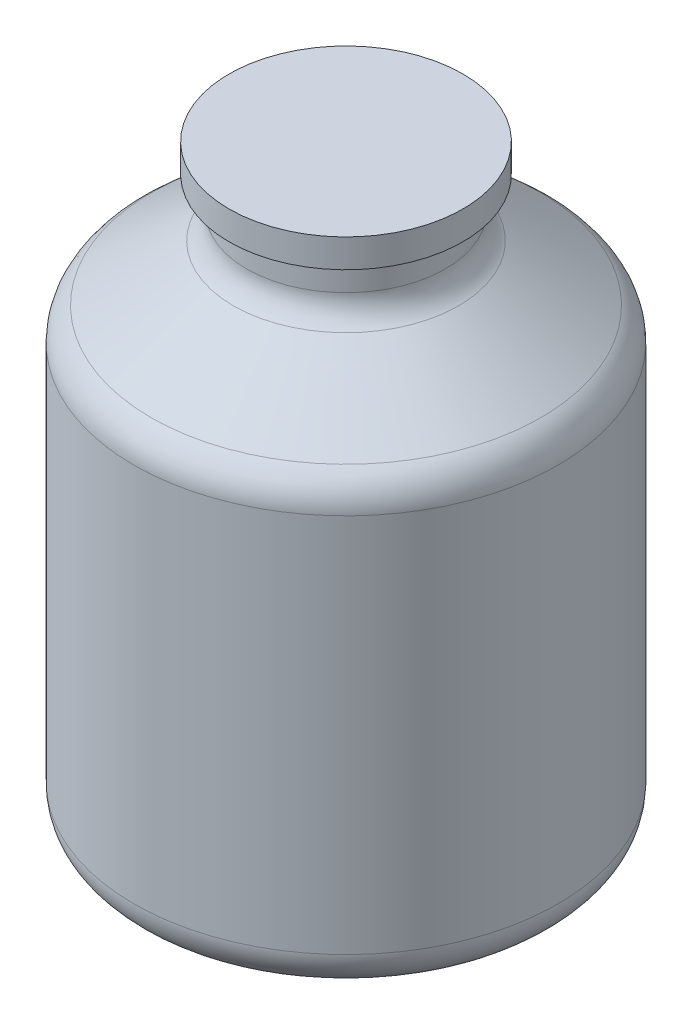
ISO-10303-21;
HEADER;
FILE_DESCRIPTION(('STEP AP214'),'2;1');
FILE_NAME('part.step','',(''),(''),'','','');
FILE_SCHEMA(('AUTOMOTIVE_DESIGN { 1 0 10303 214 1 1 1 1 }'));
ENDSEC;
DATA;
#1=APPLICATION_CONTEXT('core data for automotive mechanical design processes');
#2=APPLICATION_PROTOCOL_DEFINITION('international standard','automotive_design',2000,#1);
#3=PRODUCT_CONTEXT('',#1,'mechanical');
#4=PRODUCT('Part','Part','',(#3));
#5=PRODUCT_RELATED_PRODUCT_CATEGORY('part','',(#4));
#6=PRODUCT_DEFINITION_FORMATION('','',#4);
#7=PRODUCT_DEFINITION_CONTEXT('part definition',#1,'design');
#8=PRODUCT_DEFINITION('design','',#6,#7);
#9=PRODUCT_DEFINITION_SHAPE('','',#8);
#10=(LENGTH_UNIT() NAMED_UNIT(*) SI_UNIT(.MILLI.,.METRE.));
#11=(NAMED_UNIT(*) PLANE_ANGLE_UNIT() SI_UNIT($,.RADIAN.));
#12=(NAMED_UNIT(*) SI_UNIT($,.STERADIAN.) SOLID_ANGLE_UNIT());
#13=UNCERTAINTY_MEASURE_WITH_UNIT(LENGTH_MEASURE(1.E-05),#10,'distance_accuracy_value','');
#14=(GEOMETRIC_REPRESENTATION_CONTEXT(3) GLOBAL_UNCERTAINTY_ASSIGNED_CONTEXT((#13)) GLOBAL_UNIT_ASSIGNED_CONTEXT((#10,
#11,#12)) REPRESENTATION_CONTEXT('',''));
#15=CARTESIAN_POINT('',(0.,0.,0.));
#16=DIRECTION('',(0.,0.,1.));
#17=DIRECTION('',(1.,0.,0.));
#18=AXIS2_PLACEMENT_3D('',#15,#16,#17);
#19=CARTESIAN_POINT('',(0.,0.,0.));
#20=DIRECTION('',(0.,1.,0.));
#21=DIRECTION('',(0.,0.,1.));
#22=AXIS2_PLACEMENT_3D('',#19,#20,#21);
#23=PLANE('',#22);
#24=CARTESIAN_POINT('',(0.,0.,0.));
#25=DIRECTION('',(0.,1.,0.));
#26=DIRECTION('',(0.,0.,1.));
#27=AXIS2_PLACEMENT_3D('',#24,#25,#26);
#28=CIRCLE('',#27,55.8506106293866);
#29=CARTESIAN_POINT('',(0.,0.,55.8506106293866));
#30=VERTEX_POINT('',#29);
#31=EDGE_CURVE('E10',#30,#30,#28,.T.);
#32=ORIENTED_EDGE('',*,*,#31,.F.);
#33=EDGE_LOOP('',(#32));
#34=FACE_BOUND('',#33,.T.);
#35=ADVANCED_FACE('F31',(#34),#23,.F.);
#36=CARTESIAN_POINT('',(0.,12.7,0.));
#37=DIRECTION('',(0.,1.,0.));
#38=DIRECTION('',(0.,0.,1.));
#39=AXIS2_PLACEMENT_3D('',#36,#37,#38);
#40=TOROIDAL_SURFACE('',#39,55.8506106293866,12.7);
#41=CARTESIAN_POINT('',(0.,12.7,0.));
#42=DIRECTION('',(0.,1.,0.));
#43=DIRECTION('',(0.,0.,1.));
#44=AXIS2_PLACEMENT_3D('',#41,#42,#43);
#45=CIRCLE('',#44,68.5506106293866);
#46=CARTESIAN_POINT('',(0.,12.7,68.5506106293866));
#47=VERTEX_POINT('',#46);
#48=EDGE_CURVE('E37',#47,#47,#45,.T.);
#49=ORIENTED_EDGE('',*,*,#48,.F.);
#50=EDGE_LOOP('',(#49));
#51=FACE_BOUND('',#50,.T.);
#52=ORIENTED_EDGE('',*,*,#31,.T.);
#53=EDGE_LOOP('',(#52));
#54=FACE_BOUND('',#53,.T.);
#55=ADVANCED_FACE('F106',(#51,#54),#40,.T.);
#56=CARTESIAN_POINT('',(0.,191.88999199796,0.));
#57=DIRECTION('',(0.,1.,0.));
#58=DIRECTION('',(0.,0.,1.));
#59=AXIS2_PLACEMENT_3D('',#56,#57,#58);
#60=CYLINDRICAL_SURFACE('',#59,68.5506106293866);
#61=CARTESIAN_POINT('',(0.,135.537090780889,0.));
#62=DIRECTION('',(0.,1.,0.));
#63=DIRECTION('',(0.,0.,1.));
#64=AXIS2_PLACEMENT_3D('',#61,#62,#63);
#65=CIRCLE('',#64,68.5506106293866);
#66=CARTESIAN_POINT('',(0.,135.537090780889,68.5506106293866));
#67=VERTEX_POINT('',#66);
#68=EDGE_CURVE('E41',#67,#67,#65,.T.);
#69=ORIENTED_EDGE('',*,*,#68,.F.);
#70=EDGE_LOOP('',(#69));
#71=FACE_BOUND('',#70,.T.);
#72=ORIENTED_EDGE('',*,*,#48,.T.);
#73=EDGE_LOOP('',(#72));
#74=FACE_BOUND('',#73,.T.);
#75=ADVANCED_FACE('F101',(#71,#74),#60,.T.);
#76=CARTESIAN_POINT('',(0.,135.537090780889,0.));
#77=DIRECTION('',(0.,1.,0.));
#78=DIRECTION('',(0.,0.,1.));
#79=AXIS2_PLACEMENT_3D('',#76,#77,#78);
#80=TOROIDAL_SURFACE('',#79,55.8506106293866,12.7);
#81=CARTESIAN_POINT('',(0.,146.041145392436,0.));
#82=DIRECTION('',(0.,1.,0.));
#83=DIRECTION('',(0.,0.,1.));
#84=AXIS2_PLACEMENT_3D('',#81,#82,#83);
#85=CIRCLE('',#84,62.9888762953326);
#86=CARTESIAN_POINT('',(0.,146.041145392436,62.9888762953326));
#87=VERTEX_POINT('',#86);
#88=EDGE_CURVE('E45',#87,#87,#85,.T.);
#89=ORIENTED_EDGE('',*,*,#88,.F.);
#90=EDGE_LOOP('',(#89));
#91=FACE_BOUND('',#90,.T.);
#92=ORIENTED_EDGE('',*,*,#68,.T.);
#93=EDGE_LOOP('',(#92));
#94=FACE_BOUND('',#93,.T.);
#95=ADVANCED_FACE('F95',(#91,#94),#80,.T.);
#96=CARTESIAN_POINT('',(0.,146.041145392436,0.));
#97=DIRECTION('',(0.,-1.,0.));
#98=DIRECTION('',(0.,0.,-1.));
#99=AXIS2_PLACEMENT_3D('',#96,#97,#98);
#100=CONICAL_SURFACE('',#99,62.9888762953326,0.973912118745665);
#101=CARTESIAN_POINT('',(0.,164.092378592853,0.));
#102=DIRECTION('',(0.,1.,0.));
#103=DIRECTION('',(0.,0.,1.));
#104=AXIS2_PLACEMENT_3D('',#101,#102,#103);
#105=CIRCLE('',#104,36.4262421463226);
#106=CARTESIAN_POINT('',(0.,164.092378592853,36.4262421463226));
#107=VERTEX_POINT('',#106);
#108=EDGE_CURVE('E50',#107,#107,#105,.T.);
#109=ORIENTED_EDGE('',*,*,#108,.F.);
#110=EDGE_LOOP('',(#109));
#111=FACE_BOUND('',#110,.T.);
#112=ORIENTED_EDGE('',*,*,#88,.T.);
#113=EDGE_LOOP('',(#112));
#114=FACE_BOUND('',#113,.T.);
#115=ADVANCED_FACE('F89',(#111,#114),#100,.T.);
#116=CARTESIAN_POINT('',(0.,172.244930881121,0.));
#117=DIRECTION('',(0.,1.,0.));
#118=DIRECTION('',(0.,0.,1.));
#119=AXIS2_PLACEMENT_3D('',#116,#117,#118);
#120=TOROIDAL_SURFACE('',#119,41.9664917205388,9.85689982487104);
#121=CARTESIAN_POINT('',(0.,172.244930881121,0.));
#122=DIRECTION('',(0.,1.,0.));
#123=DIRECTION('',(0.,0.,1.));
#124=AXIS2_PLACEMENT_3D('',#121,#122,#123);
#125=CIRCLE('',#124,32.1095918956678);
#126=CARTESIAN_POINT('',(0.,172.244930881121,32.1095918956678));
#127=VERTEX_POINT('',#126);
#128=EDGE_CURVE('E53',#127,#127,#125,.T.);
#129=ORIENTED_EDGE('',*,*,#128,.F.);
#130=EDGE_LOOP('',(#129));
#131=FACE_BOUND('',#130,.T.);
#132=ORIENTED_EDGE('',*,*,#108,.T.);
#133=EDGE_LOOP('',(#132));
#134=FACE_BOUND('',#133,.T.);
#135=ADVANCED_FACE('F83',(#131,#134),#120,.F.);
#136=CARTESIAN_POINT('',(0.,191.88999199796,0.));
#137=DIRECTION('',(0.,1.,0.));
#138=DIRECTION('',(0.,0.,1.));
#139=AXIS2_PLACEMENT_3D('',#136,#137,#138);
#140=CYLINDRICAL_SURFACE('',#139,32.1095918956678);
#141=CARTESIAN_POINT('',(0.,182.693006016334,0.));
#142=DIRECTION('',(0.,1.,0.));
#143=DIRECTION('',(0.,0.,1.));
#144=AXIS2_PLACEMENT_3D('',#141,#142,#143);
#145=CIRCLE('',#144,32.1095918956678);
#146=CARTESIAN_POINT('',(0.,182.693006016334,32.1095918956678));
#147=VERTEX_POINT('',#146);
#148=EDGE_CURVE('E56',#147,#147,#145,.T.);
#149=ORIENTED_EDGE('',*,*,#148,.F.);
#150=EDGE_LOOP('',(#149));
#151=FACE_BOUND('',#150,.T.);
#152=ORIENTED_EDGE('',*,*,#128,.T.);
#153=EDGE_LOOP('',(#152));
#154=FACE_BOUND('',#153,.T.);
#155=ADVANCED_FACE('F77',(#151,#154),#140,.T.);
#156=CARTESIAN_POINT('',(32.1095918956678,182.693006016334,0.));
#157=DIRECTION('',(0.,1.,0.));
#158=DIRECTION('',(0.,0.,1.));
#159=AXIS2_PLACEMENT_3D('',#156,#157,#158);
#160=PLANE('',#159);
#161=CARTESIAN_POINT('',(0.,182.693006016334,0.));
#162=DIRECTION('',(0.,1.,0.));
#163=DIRECTION('',(0.,0.,1.));
#164=AXIS2_PLACEMENT_3D('',#161,#162,#163);
#165=CIRCLE('',#164,37.8125387824389);
#166=CARTESIAN_POINT('',(0.,182.693006016334,37.8125387824389));
#167=VERTEX_POINT('',#166);
#168=EDGE_CURVE('E59',#167,#167,#165,.T.);
#169=ORIENTED_EDGE('',*,*,#168,.F.);
#170=EDGE_LOOP('',(#169));
#171=FACE_BOUND('',#170,.T.);
#172=ORIENTED_EDGE('',*,*,#148,.T.);
#173=EDGE_LOOP('',(#172));
#174=FACE_BOUND('',#173,.T.);
#175=ADVANCED_FACE('F71',(#171,#174),#160,.F.);
#176=CARTESIAN_POINT('',(0.,191.88999199796,0.));
#177=DIRECTION('',(0.,1.,0.));
#178=DIRECTION('',(0.,0.,1.));
#179=AXIS2_PLACEMENT_3D('',#176,#177,#178);
#180=CYLINDRICAL_SURFACE('',#179,37.8125387824389);
#181=CARTESIAN_POINT('',(0.,191.88999199796,0.));
#182=DIRECTION('',(0.,1.,0.));
#183=DIRECTION('',(0.,0.,1.));
#184=AXIS2_PLACEMENT_3D('',#181,#182,#183);
#185=CIRCLE('',#184,37.8125387824389);
#186=CARTESIAN_POINT('',(0.,191.88999199796,37.8125387824389));
#187=VERTEX_POINT('',#186);
#188=EDGE_CURVE('E62',#187,#187,#185,.T.);
#189=ORIENTED_EDGE('',*,*,#188,.F.);
#190=EDGE_LOOP('',(#189));
#191=FACE_BOUND('',#190,.T.);
#192=ORIENTED_EDGE('',*,*,#168,.T.);
#193=EDGE_LOOP('',(#192));
#194=FACE_BOUND('',#193,.T.);
#195=ADVANCED_FACE('F68',(#191,#194),#180,.T.);
#196=CARTESIAN_POINT('',(37.8125387824389,191.88999199796,0.));
#197=DIRECTION('',(0.,-1.,0.));
#198=DIRECTION('',(0.,0.,-1.));
#199=AXIS2_PLACEMENT_3D('',#196,#197,#198);
#200=PLANE('',#199);
#201=ORIENTED_EDGE('',*,*,#188,.T.);
#202=EDGE_LOOP('',(#201));
#203=FACE_BOUND('',#202,.T.);
#204=ADVANCED_FACE('F66',(#203),#200,.F.);
#205=CLOSED_SHELL('',(#35,#55,#75,#95,#115,#135,#155,#175,#195,#204));
#206=MANIFOLD_SOLID_BREP('B2',#205);
#207=ADVANCED_BREP_SHAPE_REPRESENTATION('',(#18,#206),#14);
#208=SHAPE_DEFINITION_REPRESENTATION(#9,#207);
ENDSEC;
END-ISO-10303-21;
